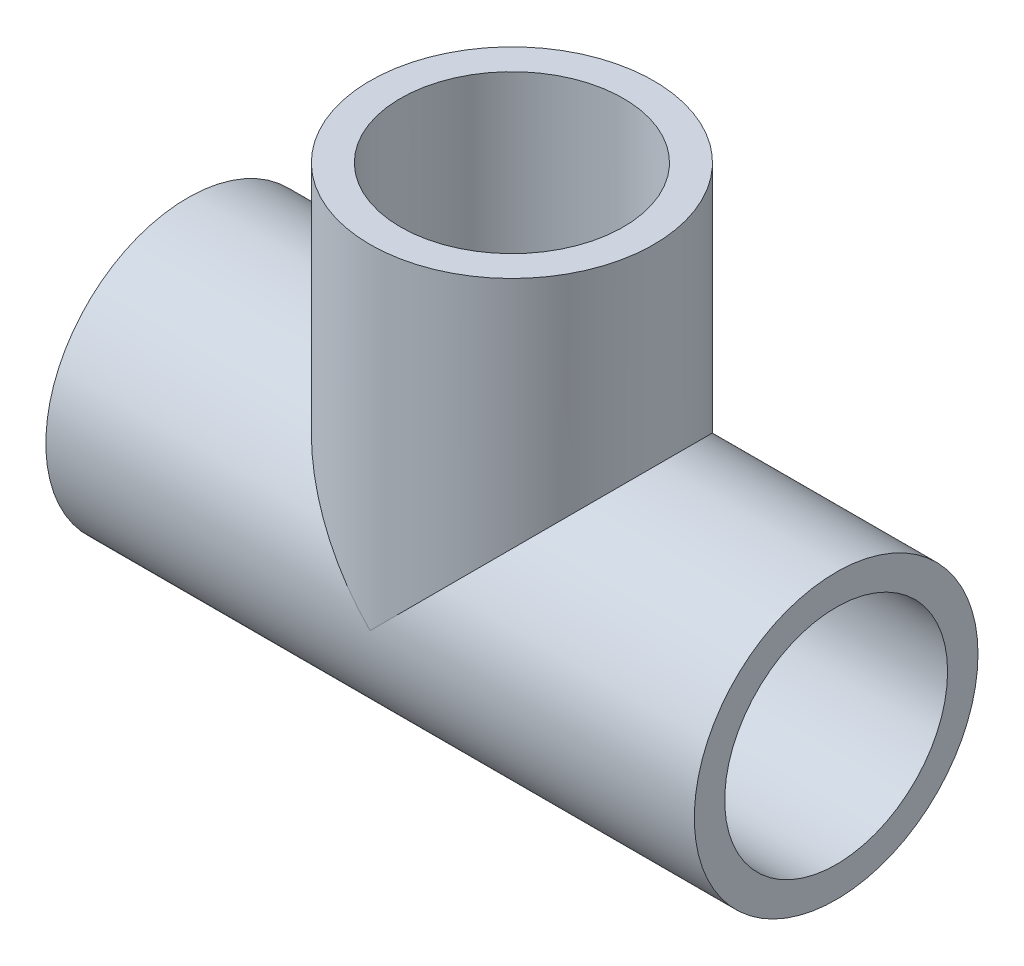
ISO-10303-21;
HEADER;
FILE_DESCRIPTION(('STEP AP214'),'2;1');
FILE_NAME('part.step','',(''),(''),'','','');
FILE_SCHEMA(('AUTOMOTIVE_DESIGN { 1 0 10303 214 1 1 1 1 }'));
ENDSEC;
DATA;
#1=APPLICATION_CONTEXT('core data for automotive mechanical design processes');
#2=APPLICATION_PROTOCOL_DEFINITION('international standard','automotive_design',2000,#1);
#3=PRODUCT_CONTEXT('',#1,'mechanical');
#4=PRODUCT('Part','Part','',(#3));
#5=PRODUCT_RELATED_PRODUCT_CATEGORY('part','',(#4));
#6=PRODUCT_DEFINITION_FORMATION('','',#4);
#7=PRODUCT_DEFINITION_CONTEXT('part definition',#1,'design');
#8=PRODUCT_DEFINITION('design','',#6,#7);
#9=PRODUCT_DEFINITION_SHAPE('','',#8);
#10=(LENGTH_UNIT() NAMED_UNIT(*) SI_UNIT(.MILLI.,.METRE.));
#11=(NAMED_UNIT(*) PLANE_ANGLE_UNIT() SI_UNIT($,.RADIAN.));
#12=(NAMED_UNIT(*) SI_UNIT($,.STERADIAN.) SOLID_ANGLE_UNIT());
#13=UNCERTAINTY_MEASURE_WITH_UNIT(LENGTH_MEASURE(1.E-05),#10,'distance_accuracy_value','');
#14=(GEOMETRIC_REPRESENTATION_CONTEXT(3) GLOBAL_UNCERTAINTY_ASSIGNED_CONTEXT((#13)) GLOBAL_UNIT_ASSIGNED_CONTEXT((#10,
#11,#12)) REPRESENTATION_CONTEXT('',''));
#15=CARTESIAN_POINT('',(0.,0.,0.));
#16=DIRECTION('',(0.,0.,1.));
#17=DIRECTION('',(1.,0.,0.));
#18=AXIS2_PLACEMENT_3D('',#15,#16,#17);
#19=CARTESIAN_POINT('',(32.,0.,0.));
#20=DIRECTION('',(-1.,0.,0.));
#21=DIRECTION('',(0.,-1.,0.));
#22=AXIS2_PLACEMENT_3D('',#19,#20,#21);
#23=CYLINDRICAL_SURFACE('',#22,14.);
#24=CARTESIAN_POINT('',(32.,0.,0.));
#25=DIRECTION('',(1.,0.,0.));
#26=DIRECTION('',(0.,0.,-1.));
#27=AXIS2_PLACEMENT_3D('',#24,#25,#26);
#28=CIRCLE('',#27,14.);
#29=CARTESIAN_POINT('',(32.,0.,-14.));
#30=VERTEX_POINT('',#29);
#31=EDGE_CURVE('E82',#30,#30,#28,.T.);
#32=ORIENTED_EDGE('',*,*,#31,.F.);
#33=EDGE_LOOP('',(#32));
#34=FACE_BOUND('',#33,.T.);
#35=CARTESIAN_POINT('',(-32.,0.,0.));
#36=DIRECTION('',(1.,0.,0.));
#37=DIRECTION('',(0.,0.,-1.));
#38=AXIS2_PLACEMENT_3D('',#35,#36,#37);
#39=CIRCLE('',#38,14.);
#40=CARTESIAN_POINT('',(-32.,0.,-14.));
#41=VERTEX_POINT('',#40);
#42=EDGE_CURVE('E78',#41,#41,#39,.T.);
#43=ORIENTED_EDGE('',*,*,#42,.T.);
#44=EDGE_LOOP('',(#43));
#45=FACE_BOUND('',#44,.T.);
#46=CARTESIAN_POINT('',(0.,0.,0.));
#47=DIRECTION('',(-0.707106781186547,-0.707106781186547,0.));
#48=DIRECTION('',(-0.707106781186548,0.707106781186547,0.));
#49=AXIS2_PLACEMENT_3D('',#46,#47,#48);
#50=ELLIPSE('',#49,19.7989898732233,14.);
#51=CARTESIAN_POINT('',(0.,0.,-14.));
#52=VERTEX_POINT('',#51);
#53=CARTESIAN_POINT('',(0.,0.,14.));
#54=VERTEX_POINT('',#53);
#55=EDGE_CURVE('E85',#52,#54,#50,.F.);
#56=ORIENTED_EDGE('',*,*,#55,.F.);
#57=CARTESIAN_POINT('',(0.,0.,0.));
#58=DIRECTION('',(-0.707106781186548,0.707106781186547,0.));
#59=DIRECTION('',(-0.707106781186547,-0.707106781186547,0.));
#60=AXIS2_PLACEMENT_3D('',#57,#58,#59);
#61=ELLIPSE('',#60,19.7989898732233,14.);
#62=EDGE_CURVE('E50',#54,#52,#61,.T.);
#63=ORIENTED_EDGE('',*,*,#62,.F.);
#64=EDGE_LOOP('',(#56,#63));
#65=FACE_BOUND('',#64,.T.);
#66=ADVANCED_FACE('F32',(#34,#45,#65),#23,.T.);
#67=CARTESIAN_POINT('',(32.,0.,0.));
#68=DIRECTION('',(1.,0.,0.));
#69=DIRECTION('',(0.,0.,-1.));
#70=AXIS2_PLACEMENT_3D('',#67,#68,#69);
#71=PLANE('',#70);
#72=CARTESIAN_POINT('',(32.,0.,0.));
#73=DIRECTION('',(1.,0.,0.));
#74=DIRECTION('',(0.,0.,-1.));
#75=AXIS2_PLACEMENT_3D('',#72,#73,#74);
#76=CIRCLE('',#75,11.);
#77=CARTESIAN_POINT('',(32.,0.,-11.));
#78=VERTEX_POINT('',#77);
#79=EDGE_CURVE('E76',#78,#78,#76,.F.);
#80=ORIENTED_EDGE('',*,*,#79,.T.);
#81=EDGE_LOOP('',(#80));
#82=FACE_BOUND('',#81,.T.);
#83=ORIENTED_EDGE('',*,*,#31,.T.);
#84=EDGE_LOOP('',(#83));
#85=FACE_BOUND('',#84,.T.);
#86=ADVANCED_FACE('F110',(#82,#85),#71,.T.);
#87=CARTESIAN_POINT('',(-32.,0.,0.));
#88=DIRECTION('',(1.,0.,0.));
#89=DIRECTION('',(0.,0.,-1.));
#90=AXIS2_PLACEMENT_3D('',#87,#88,#89);
#91=PLANE('',#90);
#92=CARTESIAN_POINT('',(-32.,0.,0.));
#93=DIRECTION('',(1.,0.,0.));
#94=DIRECTION('',(0.,0.,-1.));
#95=AXIS2_PLACEMENT_3D('',#92,#93,#94);
#96=CIRCLE('',#95,11.);
#97=CARTESIAN_POINT('',(-32.,0.,-11.));
#98=VERTEX_POINT('',#97);
#99=EDGE_CURVE('E66',#98,#98,#96,.F.);
#100=ORIENTED_EDGE('',*,*,#99,.F.);
#101=EDGE_LOOP('',(#100));
#102=FACE_BOUND('',#101,.T.);
#103=ORIENTED_EDGE('',*,*,#42,.F.);
#104=EDGE_LOOP('',(#103));
#105=FACE_BOUND('',#104,.T.);
#106=ADVANCED_FACE('F112',(#102,#105),#91,.F.);
#107=CARTESIAN_POINT('',(0.,33.,0.));
#108=DIRECTION('',(0.,-1.,0.));
#109=DIRECTION('',(0.,0.,-1.));
#110=AXIS2_PLACEMENT_3D('',#107,#108,#109);
#111=CYLINDRICAL_SURFACE('',#110,14.);
#112=CARTESIAN_POINT('',(0.,33.,0.));
#113=DIRECTION('',(0.,1.,0.));
#114=DIRECTION('',(0.,0.,1.));
#115=AXIS2_PLACEMENT_3D('',#112,#113,#114);
#116=CIRCLE('',#115,14.);
#117=CARTESIAN_POINT('',(0.,33.,14.));
#118=VERTEX_POINT('',#117);
#119=EDGE_CURVE('E91',#118,#118,#116,.T.);
#120=ORIENTED_EDGE('',*,*,#119,.F.);
#121=EDGE_LOOP('',(#120));
#122=FACE_BOUND('',#121,.T.);
#123=ORIENTED_EDGE('',*,*,#62,.T.);
#124=ORIENTED_EDGE('',*,*,#55,.T.);
#125=EDGE_LOOP('',(#123,#124));
#126=FACE_BOUND('',#125,.T.);
#127=ADVANCED_FACE('F106',(#122,#126),#111,.T.);
#128=CARTESIAN_POINT('',(0.,33.,0.));
#129=DIRECTION('',(0.,-1.,0.));
#130=DIRECTION('',(0.,0.,-1.));
#131=AXIS2_PLACEMENT_3D('',#128,#129,#130);
#132=CYLINDRICAL_SURFACE('',#131,11.);
#133=CARTESIAN_POINT('',(0.,33.,0.));
#134=DIRECTION('',(0.,1.,0.));
#135=DIRECTION('',(0.,0.,1.));
#136=AXIS2_PLACEMENT_3D('',#133,#134,#135);
#137=CIRCLE('',#136,11.);
#138=CARTESIAN_POINT('',(0.,33.,11.));
#139=VERTEX_POINT('',#138);
#140=EDGE_CURVE('E93',#139,#139,#137,.T.);
#141=ORIENTED_EDGE('',*,*,#140,.T.);
#142=EDGE_LOOP('',(#141));
#143=FACE_BOUND('',#142,.T.);
#144=CARTESIAN_POINT('',(0.,0.,0.));
#145=DIRECTION('',(-0.707106781186547,-0.707106781186547,0.));
#146=DIRECTION('',(-0.707106781186548,0.707106781186547,0.));
#147=AXIS2_PLACEMENT_3D('',#144,#145,#146);
#148=ELLIPSE('',#147,15.556349186104,11.);
#149=CARTESIAN_POINT('',(0.,0.,-11.));
#150=VERTEX_POINT('',#149);
#151=CARTESIAN_POINT('',(0.,0.,11.));
#152=VERTEX_POINT('',#151);
#153=EDGE_CURVE('E39',#150,#152,#148,.F.);
#154=ORIENTED_EDGE('',*,*,#153,.F.);
#155=CARTESIAN_POINT('',(0.,0.,0.));
#156=DIRECTION('',(-0.707106781186548,0.707106781186547,0.));
#157=DIRECTION('',(-0.707106781186547,-0.707106781186547,0.));
#158=AXIS2_PLACEMENT_3D('',#155,#156,#157);
#159=ELLIPSE('',#158,15.556349186104,11.);
#160=EDGE_CURVE('E11',#152,#150,#159,.T.);
#161=ORIENTED_EDGE('',*,*,#160,.F.);
#162=EDGE_LOOP('',(#154,#161));
#163=FACE_BOUND('',#162,.T.);
#164=ADVANCED_FACE('F64',(#143,#163),#132,.F.);
#165=CARTESIAN_POINT('',(0.,33.,0.));
#166=DIRECTION('',(0.,1.,0.));
#167=DIRECTION('',(0.,0.,1.));
#168=AXIS2_PLACEMENT_3D('',#165,#166,#167);
#169=PLANE('',#168);
#170=ORIENTED_EDGE('',*,*,#119,.T.);
#171=EDGE_LOOP('',(#170));
#172=FACE_BOUND('',#171,.T.);
#173=ORIENTED_EDGE('',*,*,#140,.F.);
#174=EDGE_LOOP('',(#173));
#175=FACE_BOUND('',#174,.T.);
#176=ADVANCED_FACE('F70',(#172,#175),#169,.T.);
#177=CARTESIAN_POINT('',(32.,0.,0.));
#178=DIRECTION('',(-1.,0.,0.));
#179=DIRECTION('',(0.,-1.,0.));
#180=AXIS2_PLACEMENT_3D('',#177,#178,#179);
#181=CYLINDRICAL_SURFACE('',#180,11.);
#182=ORIENTED_EDGE('',*,*,#153,.T.);
#183=ORIENTED_EDGE('',*,*,#160,.T.);
#184=EDGE_LOOP('',(#182,#183));
#185=FACE_BOUND('',#184,.T.);
#186=ORIENTED_EDGE('',*,*,#99,.T.);
#187=EDGE_LOOP('',(#186));
#188=FACE_BOUND('',#187,.T.);
#189=ORIENTED_EDGE('',*,*,#79,.F.);
#190=EDGE_LOOP('',(#189));
#191=FACE_BOUND('',#190,.T.);
#192=ADVANCED_FACE('F67',(#185,#188,#191),#181,.F.);
#193=CLOSED_SHELL('',(#66,#86,#106,#127,#164,#176,#192));
#194=MANIFOLD_SOLID_BREP('B2',#193);
#195=ADVANCED_BREP_SHAPE_REPRESENTATION('',(#18,#194),#14);
#196=SHAPE_DEFINITION_REPRESENTATION(#9,#195);
ENDSEC;
END-ISO-10303-21;
